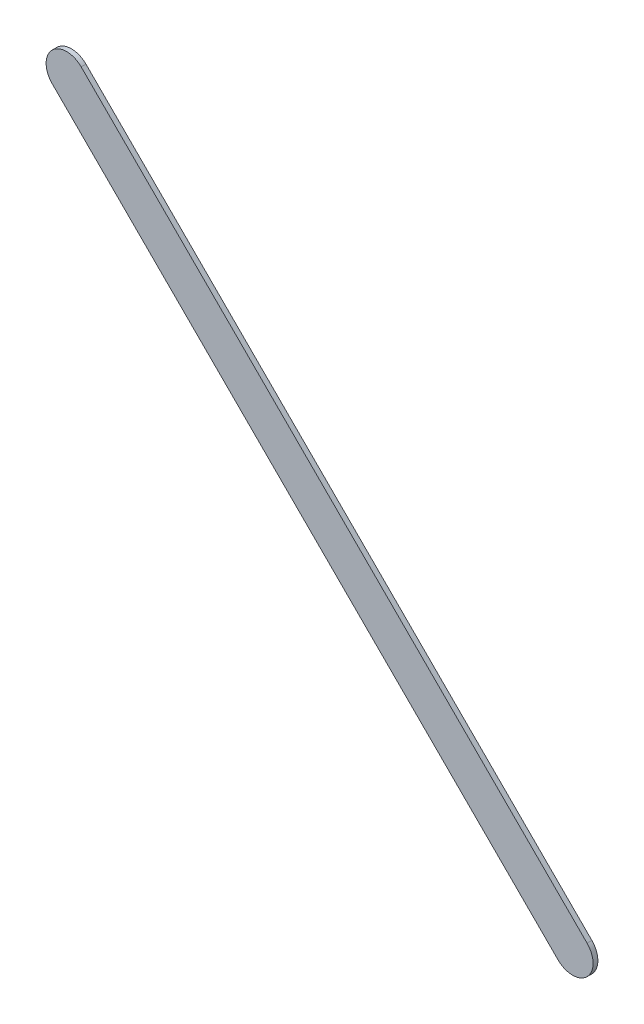
ISO-10303-21;
HEADER;
FILE_DESCRIPTION(('STEP AP214'),'2;1');
FILE_NAME('part.step','',(''),(''),'','','');
FILE_SCHEMA(('AUTOMOTIVE_DESIGN { 1 0 10303 214 1 1 1 1 }'));
ENDSEC;
DATA;
#1=APPLICATION_CONTEXT('core data for automotive mechanical design processes');
#2=APPLICATION_PROTOCOL_DEFINITION('international standard','automotive_design',2000,#1);
#3=PRODUCT_CONTEXT('',#1,'mechanical');
#4=PRODUCT('Part','Part','',(#3));
#5=PRODUCT_RELATED_PRODUCT_CATEGORY('part','',(#4));
#6=PRODUCT_DEFINITION_FORMATION('','',#4);
#7=PRODUCT_DEFINITION_CONTEXT('part definition',#1,'design');
#8=PRODUCT_DEFINITION('design','',#6,#7);
#9=PRODUCT_DEFINITION_SHAPE('','',#8);
#10=(LENGTH_UNIT() NAMED_UNIT(*) SI_UNIT(.MILLI.,.METRE.));
#11=(NAMED_UNIT(*) PLANE_ANGLE_UNIT() SI_UNIT($,.RADIAN.));
#12=(NAMED_UNIT(*) SI_UNIT($,.STERADIAN.) SOLID_ANGLE_UNIT());
#13=UNCERTAINTY_MEASURE_WITH_UNIT(LENGTH_MEASURE(1.E-05),#10,'distance_accuracy_value','');
#14=(GEOMETRIC_REPRESENTATION_CONTEXT(3) GLOBAL_UNCERTAINTY_ASSIGNED_CONTEXT((#13)) GLOBAL_UNIT_ASSIGNED_CONTEXT((#10,
#11,#12)) REPRESENTATION_CONTEXT('',''));
#15=CARTESIAN_POINT('',(0.,0.,0.));
#16=DIRECTION('',(0.,0.,1.));
#17=DIRECTION('',(1.,0.,0.));
#18=AXIS2_PLACEMENT_3D('',#15,#16,#17);
#19=CARTESIAN_POINT('',(103.966066,-49.453933,1.635));
#20=DIRECTION('',(0.,0.,1.));
#21=DIRECTION('',(1.,0.,0.));
#22=AXIS2_PLACEMENT_3D('',#19,#20,#21);
#23=PLANE('',#22);
#24=DIRECTION('',(-0.707106781186548,0.707106781186548,0.));
#25=VECTOR('',#24,1.);
#26=CARTESIAN_POINT('',(103.966066,-49.453933,1.635));
#27=LINE('',#26,#25);
#28=CARTESIAN_POINT('',(103.966066,-49.453933,1.635));
#29=VERTEX_POINT('',#28);
#30=CARTESIAN_POINT('',(100.266066,-45.753933,1.635));
#31=VERTEX_POINT('',#30);
#32=EDGE_CURVE('E83',#29,#31,#27,.T.);
#33=ORIENTED_EDGE('',*,*,#32,.T.);
#34=CARTESIAN_POINT('',(100.1599995,-45.8599995,1.635));
#35=DIRECTION('',(0.,0.,1.));
#36=DIRECTION('',(0.707106781186548,0.707106781186548,0.));
#37=AXIS2_PLACEMENT_3D('',#34,#35,#36);
#38=CIRCLE('',#37,0.150000682813);
#39=CARTESIAN_POINT('',(100.053933,-45.966066,1.635));
#40=VERTEX_POINT('',#39);
#41=EDGE_CURVE('E81',#31,#40,#38,.T.);
#42=ORIENTED_EDGE('',*,*,#41,.T.);
#43=DIRECTION('',(0.707106781186548,-0.707106781186548,0.));
#44=VECTOR('',#43,1.);
#45=CARTESIAN_POINT('',(100.053933,-45.966066,1.635));
#46=LINE('',#45,#44);
#47=CARTESIAN_POINT('',(103.753933,-49.666066,1.635));
#48=VERTEX_POINT('',#47);
#49=EDGE_CURVE('E71',#40,#48,#46,.T.);
#50=ORIENTED_EDGE('',*,*,#49,.T.);
#51=CARTESIAN_POINT('',(103.8599995,-49.5599995,1.635));
#52=DIRECTION('',(0.,0.,1.));
#53=DIRECTION('',(-0.707106781186548,-0.707106781186548,0.));
#54=AXIS2_PLACEMENT_3D('',#51,#52,#53);
#55=CIRCLE('',#54,0.150000682813);
#56=EDGE_CURVE('E11',#48,#29,#55,.T.);
#57=ORIENTED_EDGE('',*,*,#56,.T.);
#58=EDGE_LOOP('',(#33,#42,#50,#57));
#59=FACE_BOUND('',#58,.T.);
#60=ADVANCED_FACE('F17',(#59),#23,.T.);
#61=CARTESIAN_POINT('',(103.966066,-49.453933,1.6));
#62=DIRECTION('',(0.,0.,1.));
#63=DIRECTION('',(1.,0.,0.));
#64=AXIS2_PLACEMENT_3D('',#61,#62,#63);
#65=PLANE('',#64);
#66=CARTESIAN_POINT('',(103.8599995,-49.5599995,1.6));
#67=DIRECTION('',(0.,0.,1.));
#68=DIRECTION('',(-0.707106781186548,-0.707106781186548,0.));
#69=AXIS2_PLACEMENT_3D('',#66,#67,#68);
#70=CIRCLE('',#69,0.150000682813);
#71=CARTESIAN_POINT('',(103.753933,-49.666066,1.6));
#72=VERTEX_POINT('',#71);
#73=CARTESIAN_POINT('',(103.966066,-49.453933,1.6));
#74=VERTEX_POINT('',#73);
#75=EDGE_CURVE('E20',#72,#74,#70,.T.);
#76=ORIENTED_EDGE('',*,*,#75,.F.);
#77=DIRECTION('',(0.707106781186548,-0.707106781186548,0.));
#78=VECTOR('',#77,1.);
#79=CARTESIAN_POINT('',(100.053933,-45.966066,1.6));
#80=LINE('',#79,#78);
#81=CARTESIAN_POINT('',(100.053933,-45.966066,1.6));
#82=VERTEX_POINT('',#81);
#83=EDGE_CURVE('E64',#82,#72,#80,.T.);
#84=ORIENTED_EDGE('',*,*,#83,.F.);
#85=CARTESIAN_POINT('',(100.1599995,-45.8599995,1.6));
#86=DIRECTION('',(0.,0.,1.));
#87=DIRECTION('',(0.707106781186548,0.707106781186548,0.));
#88=AXIS2_PLACEMENT_3D('',#85,#86,#87);
#89=CIRCLE('',#88,0.150000682813);
#90=CARTESIAN_POINT('',(100.266066,-45.753933,1.6));
#91=VERTEX_POINT('',#90);
#92=EDGE_CURVE('E90',#91,#82,#89,.T.);
#93=ORIENTED_EDGE('',*,*,#92,.F.);
#94=DIRECTION('',(-0.707106781186548,0.707106781186548,0.));
#95=VECTOR('',#94,1.);
#96=CARTESIAN_POINT('',(103.966066,-49.453933,1.6));
#97=LINE('',#96,#95);
#98=EDGE_CURVE('E116',#74,#91,#97,.T.);
#99=ORIENTED_EDGE('',*,*,#98,.F.);
#100=EDGE_LOOP('',(#76,#84,#93,#99));
#101=FACE_BOUND('',#100,.T.);
#102=ADVANCED_FACE('F163',(#101),#65,.F.);
#103=CARTESIAN_POINT('',(103.8599995,-49.5599995,1.6));
#104=DIRECTION('',(0.,0.,-1.));
#105=DIRECTION('',(-0.707106781186548,-0.707106781186548,0.));
#106=AXIS2_PLACEMENT_3D('',#103,#104,#105);
#107=CYLINDRICAL_SURFACE('',#106,0.150000682813);
#108=ORIENTED_EDGE('',*,*,#75,.T.);
#109=DIRECTION('',(0.,0.,1.));
#110=VECTOR('',#109,1.);
#111=CARTESIAN_POINT('',(103.966066,-49.453933,1.6));
#112=LINE('',#111,#110);
#113=EDGE_CURVE('E97',#74,#29,#112,.T.);
#114=ORIENTED_EDGE('',*,*,#113,.T.);
#115=ORIENTED_EDGE('',*,*,#56,.F.);
#116=DIRECTION('',(0.,0.,1.));
#117=VECTOR('',#116,1.);
#118=CARTESIAN_POINT('',(103.753933,-49.666066,1.6));
#119=LINE('',#118,#117);
#120=EDGE_CURVE('E77',#72,#48,#119,.T.);
#121=ORIENTED_EDGE('',*,*,#120,.F.);
#122=EDGE_LOOP('',(#108,#114,#115,#121));
#123=FACE_BOUND('',#122,.T.);
#124=ADVANCED_FACE('F168',(#123),#107,.T.);
#125=CARTESIAN_POINT('',(100.053933,-45.966066,1.6));
#126=DIRECTION('',(0.707106781186548,0.707106781186548,0.));
#127=DIRECTION('',(0.,0.,-1.));
#128=AXIS2_PLACEMENT_3D('',#125,#126,#127);
#129=PLANE('',#128);
#130=ORIENTED_EDGE('',*,*,#83,.T.);
#131=ORIENTED_EDGE('',*,*,#120,.T.);
#132=ORIENTED_EDGE('',*,*,#49,.F.);
#133=DIRECTION('',(0.,0.,1.));
#134=VECTOR('',#133,1.);
#135=CARTESIAN_POINT('',(100.053933,-45.966066,1.6));
#136=LINE('',#135,#134);
#137=EDGE_CURVE('E75',#82,#40,#136,.T.);
#138=ORIENTED_EDGE('',*,*,#137,.F.);
#139=EDGE_LOOP('',(#130,#131,#132,#138));
#140=FACE_BOUND('',#139,.T.);
#141=ADVANCED_FACE('F73',(#140),#129,.F.);
#142=CARTESIAN_POINT('',(100.1599995,-45.8599995,1.6));
#143=DIRECTION('',(0.,0.,-1.));
#144=DIRECTION('',(0.707106781186548,0.707106781186548,0.));
#145=AXIS2_PLACEMENT_3D('',#142,#143,#144);
#146=CYLINDRICAL_SURFACE('',#145,0.150000682813);
#147=ORIENTED_EDGE('',*,*,#92,.T.);
#148=ORIENTED_EDGE('',*,*,#137,.T.);
#149=ORIENTED_EDGE('',*,*,#41,.F.);
#150=DIRECTION('',(0.,0.,1.));
#151=VECTOR('',#150,1.);
#152=CARTESIAN_POINT('',(100.266066,-45.753933,1.6));
#153=LINE('',#152,#151);
#154=EDGE_CURVE('E121',#91,#31,#153,.T.);
#155=ORIENTED_EDGE('',*,*,#154,.F.);
#156=EDGE_LOOP('',(#147,#148,#149,#155));
#157=FACE_BOUND('',#156,.T.);
#158=ADVANCED_FACE('F89',(#157),#146,.T.);
#159=CARTESIAN_POINT('',(103.966066,-49.453933,1.6));
#160=DIRECTION('',(-0.707106781186548,-0.707106781186548,0.));
#161=DIRECTION('',(-0.707106781186548,0.707106781186548,0.));
#162=AXIS2_PLACEMENT_3D('',#159,#160,#161);
#163=PLANE('',#162);
#164=ORIENTED_EDGE('',*,*,#98,.T.);
#165=ORIENTED_EDGE('',*,*,#154,.T.);
#166=ORIENTED_EDGE('',*,*,#32,.F.);
#167=ORIENTED_EDGE('',*,*,#113,.F.);
#168=EDGE_LOOP('',(#164,#165,#166,#167));
#169=FACE_BOUND('',#168,.T.);
#170=ADVANCED_FACE('F145',(#169),#163,.F.);
#171=CLOSED_SHELL('',(#60,#102,#124,#141,#158,#170));
#172=MANIFOLD_SOLID_BREP('B1',#171);
#173=ADVANCED_BREP_SHAPE_REPRESENTATION('',(#18,#172),#14);
#174=SHAPE_DEFINITION_REPRESENTATION(#9,#173);
ENDSEC;
END-ISO-10303-21;
